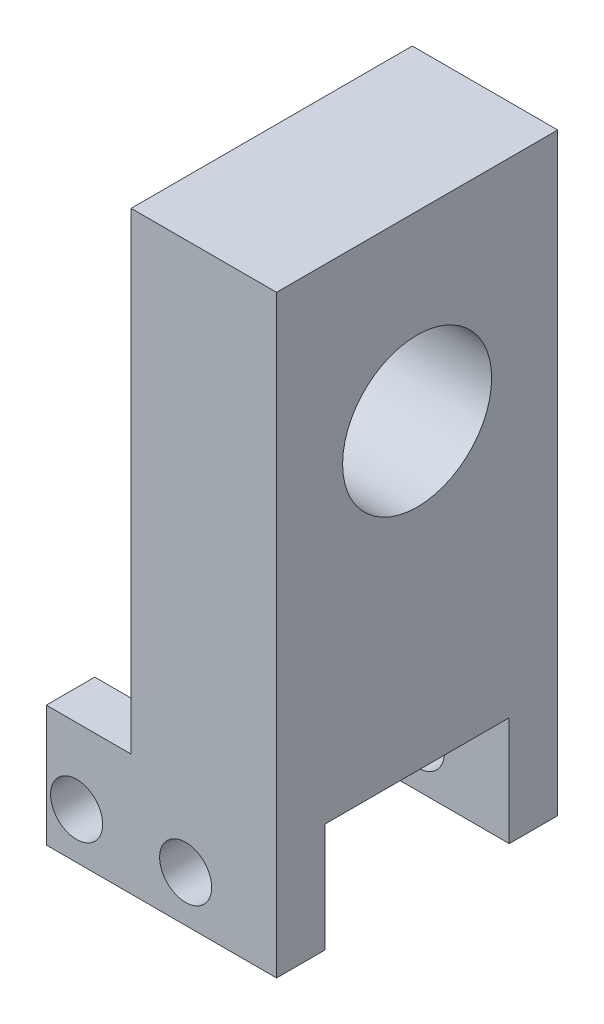
ISO-10303-21;
HEADER;
FILE_DESCRIPTION(('STEP AP214'),'2;1');
FILE_NAME('part.step','',(''),(''),'','','');
FILE_SCHEMA(('AUTOMOTIVE_DESIGN { 1 0 10303 214 1 1 1 1 }'));
ENDSEC;
DATA;
#1=APPLICATION_CONTEXT('core data for automotive mechanical design processes');
#2=APPLICATION_PROTOCOL_DEFINITION('international standard','automotive_design',2000,#1);
#3=PRODUCT_CONTEXT('',#1,'mechanical');
#4=PRODUCT('Part','Part','',(#3));
#5=PRODUCT_RELATED_PRODUCT_CATEGORY('part','',(#4));
#6=PRODUCT_DEFINITION_FORMATION('','',#4);
#7=PRODUCT_DEFINITION_CONTEXT('part definition',#1,'design');
#8=PRODUCT_DEFINITION('design','',#6,#7);
#9=PRODUCT_DEFINITION_SHAPE('','',#8);
#10=(LENGTH_UNIT() NAMED_UNIT(*) SI_UNIT(.MILLI.,.METRE.));
#11=(NAMED_UNIT(*) PLANE_ANGLE_UNIT() SI_UNIT($,.RADIAN.));
#12=(NAMED_UNIT(*) SI_UNIT($,.STERADIAN.) SOLID_ANGLE_UNIT());
#13=UNCERTAINTY_MEASURE_WITH_UNIT(LENGTH_MEASURE(1.E-05),#10,'distance_accuracy_value','');
#14=(GEOMETRIC_REPRESENTATION_CONTEXT(3) GLOBAL_UNCERTAINTY_ASSIGNED_CONTEXT((#13)) GLOBAL_UNIT_ASSIGNED_CONTEXT((#10,
#11,#12)) REPRESENTATION_CONTEXT('',''));
#15=CARTESIAN_POINT('',(0.,0.,0.));
#16=DIRECTION('',(0.,0.,1.));
#17=DIRECTION('',(1.,0.,0.));
#18=AXIS2_PLACEMENT_3D('',#15,#16,#17);
#19=CARTESIAN_POINT('',(65.,84.,61.6));
#20=DIRECTION('',(1.,0.,0.));
#21=DIRECTION('',(0.,0.,-1.));
#22=AXIS2_PLACEMENT_3D('',#19,#20,#21);
#23=PLANE('',#22);
#24=CARTESIAN_POINT('',(65.,69.,50.));
#25=DIRECTION('',(1.,0.,0.));
#26=DIRECTION('',(0.,0.,-1.));
#27=AXIS2_PLACEMENT_3D('',#24,#25,#26);
#28=CIRCLE('',#27,6.15);
#29=CARTESIAN_POINT('',(65.,69.,43.85));
#30=VERTEX_POINT('',#29);
#31=EDGE_CURVE('E231',#30,#30,#28,.T.);
#32=ORIENTED_EDGE('',*,*,#31,.T.);
#33=EDGE_LOOP('',(#32));
#34=FACE_BOUND('',#33,.T.);
#35=DIRECTION('',(0.,0.,-1.));
#36=VECTOR('',#35,1.);
#37=CARTESIAN_POINT('',(65.,45.,61.6));
#38=LINE('',#37,#36);
#39=CARTESIAN_POINT('',(65.,45.,61.6));
#40=VERTEX_POINT('',#39);
#41=CARTESIAN_POINT('',(65.,45.,57.6));
#42=VERTEX_POINT('',#41);
#43=EDGE_CURVE('E11',#40,#42,#38,.T.);
#44=ORIENTED_EDGE('',*,*,#43,.F.);
#45=DIRECTION('',(0.,-1.,0.));
#46=VECTOR('',#45,1.);
#47=CARTESIAN_POINT('',(65.,84.,61.6));
#48=LINE('',#47,#46);
#49=CARTESIAN_POINT('',(65.,84.,61.6));
#50=VERTEX_POINT('',#49);
#51=EDGE_CURVE('E191',#50,#40,#48,.T.);
#52=ORIENTED_EDGE('',*,*,#51,.F.);
#53=DIRECTION('',(0.,0.,-1.));
#54=VECTOR('',#53,1.);
#55=CARTESIAN_POINT('',(65.,84.,61.6));
#56=LINE('',#55,#54);
#57=CARTESIAN_POINT('',(65.,84.,38.4));
#58=VERTEX_POINT('',#57);
#59=EDGE_CURVE('E198',#50,#58,#56,.T.);
#60=ORIENTED_EDGE('',*,*,#59,.T.);
#61=DIRECTION('',(0.,-1.,0.));
#62=VECTOR('',#61,1.);
#63=CARTESIAN_POINT('',(65.,84.,38.4));
#64=LINE('',#63,#62);
#65=CARTESIAN_POINT('',(65.,45.,38.4));
#66=VERTEX_POINT('',#65);
#67=EDGE_CURVE('E187',#58,#66,#64,.T.);
#68=ORIENTED_EDGE('',*,*,#67,.T.);
#69=DIRECTION('',(0.,0.,-1.));
#70=VECTOR('',#69,1.);
#71=CARTESIAN_POINT('',(65.,45.,61.6));
#72=LINE('',#71,#70);
#73=CARTESIAN_POINT('',(65.,45.,42.4));
#74=VERTEX_POINT('',#73);
#75=EDGE_CURVE('E50',#74,#66,#72,.T.);
#76=ORIENTED_EDGE('',*,*,#75,.F.);
#77=DIRECTION('',(0.,-1.,0.));
#78=VECTOR('',#77,1.);
#79=CARTESIAN_POINT('',(65.,84.,42.4));
#80=LINE('',#79,#78);
#81=CARTESIAN_POINT('',(65.,44.,42.4));
#82=VERTEX_POINT('',#81);
#83=EDGE_CURVE('E190',#74,#82,#80,.T.);
#84=ORIENTED_EDGE('',*,*,#83,.T.);
#85=DIRECTION('',(0.,0.,-1.));
#86=VECTOR('',#85,1.);
#87=CARTESIAN_POINT('',(65.,44.,61.6));
#88=LINE('',#87,#86);
#89=CARTESIAN_POINT('',(65.,44.,57.6));
#90=VERTEX_POINT('',#89);
#91=EDGE_CURVE('E212',#90,#82,#88,.T.);
#92=ORIENTED_EDGE('',*,*,#91,.F.);
#93=DIRECTION('',(0.,-1.,0.));
#94=VECTOR('',#93,1.);
#95=CARTESIAN_POINT('',(65.,84.,57.6));
#96=LINE('',#95,#94);
#97=EDGE_CURVE('E54',#42,#90,#96,.T.);
#98=ORIENTED_EDGE('',*,*,#97,.F.);
#99=EDGE_LOOP('',(#44,#52,#60,#68,#76,#84,#92,#98));
#100=FACE_BOUND('',#99,.T.);
#101=ADVANCED_FACE('F39',(#34,#100),#23,.F.);
#102=CARTESIAN_POINT('',(65.,44.,61.6));
#103=DIRECTION('',(0.,1.,0.));
#104=DIRECTION('',(0.,0.,1.));
#105=AXIS2_PLACEMENT_3D('',#102,#103,#104);
#106=PLANE('',#105);
#107=DIRECTION('',(1.,0.,0.));
#108=VECTOR('',#107,1.);
#109=CARTESIAN_POINT('',(65.,44.,57.6));
#110=LINE('',#109,#108);
#111=CARTESIAN_POINT('',(77.,44.,57.6));
#112=VERTEX_POINT('',#111);
#113=EDGE_CURVE('E153',#90,#112,#110,.T.);
#114=ORIENTED_EDGE('',*,*,#113,.F.);
#115=ORIENTED_EDGE('',*,*,#91,.T.);
#116=DIRECTION('',(1.,0.,0.));
#117=VECTOR('',#116,1.);
#118=CARTESIAN_POINT('',(65.,44.,42.4));
#119=LINE('',#118,#117);
#120=CARTESIAN_POINT('',(77.,44.,42.4));
#121=VERTEX_POINT('',#120);
#122=EDGE_CURVE('E214',#82,#121,#119,.T.);
#123=ORIENTED_EDGE('',*,*,#122,.T.);
#124=DIRECTION('',(0.,0.,-1.));
#125=VECTOR('',#124,1.);
#126=CARTESIAN_POINT('',(77.,44.,61.6));
#127=LINE('',#126,#125);
#128=EDGE_CURVE('E206',#112,#121,#127,.T.);
#129=ORIENTED_EDGE('',*,*,#128,.F.);
#130=EDGE_LOOP('',(#114,#115,#123,#129));
#131=FACE_BOUND('',#130,.T.);
#132=ADVANCED_FACE('F270',(#131),#106,.F.);
#133=CARTESIAN_POINT('',(77.,44.,61.6));
#134=DIRECTION('',(-1.,0.,0.));
#135=DIRECTION('',(0.,0.,1.));
#136=AXIS2_PLACEMENT_3D('',#133,#134,#135);
#137=PLANE('',#136);
#138=CARTESIAN_POINT('',(77.,69.,50.));
#139=DIRECTION('',(1.,0.,0.));
#140=DIRECTION('',(0.,0.,-1.));
#141=AXIS2_PLACEMENT_3D('',#138,#139,#140);
#142=CIRCLE('',#141,6.15);
#143=CARTESIAN_POINT('',(77.,69.,43.85));
#144=VERTEX_POINT('',#143);
#145=EDGE_CURVE('E238',#144,#144,#142,.T.);
#146=ORIENTED_EDGE('',*,*,#145,.F.);
#147=EDGE_LOOP('',(#146));
#148=FACE_BOUND('',#147,.T.);
#149=DIRECTION('',(0.,1.,0.));
#150=VECTOR('',#149,1.);
#151=CARTESIAN_POINT('',(77.,44.,61.6));
#152=LINE('',#151,#150);
#153=CARTESIAN_POINT('',(77.,35.,61.6));
#154=VERTEX_POINT('',#153);
#155=CARTESIAN_POINT('',(77.,84.,61.6));
#156=VERTEX_POINT('',#155);
#157=EDGE_CURVE('E193',#154,#156,#152,.T.);
#158=ORIENTED_EDGE('',*,*,#157,.F.);
#159=DIRECTION('',(0.,0.,-1.));
#160=VECTOR('',#159,1.);
#161=CARTESIAN_POINT('',(77.,35.,61.6));
#162=LINE('',#161,#160);
#163=CARTESIAN_POINT('',(77.,35.,57.6));
#164=VERTEX_POINT('',#163);
#165=EDGE_CURVE('E133',#154,#164,#162,.T.);
#166=ORIENTED_EDGE('',*,*,#165,.T.);
#167=DIRECTION('',(0.,1.,0.));
#168=VECTOR('',#167,1.);
#169=CARTESIAN_POINT('',(77.,35.,57.6));
#170=LINE('',#169,#168);
#171=EDGE_CURVE('E250',#164,#112,#170,.T.);
#172=ORIENTED_EDGE('',*,*,#171,.T.);
#173=ORIENTED_EDGE('',*,*,#128,.T.);
#174=DIRECTION('',(0.,1.,0.));
#175=VECTOR('',#174,1.);
#176=CARTESIAN_POINT('',(77.,35.,42.4));
#177=LINE('',#176,#175);
#178=CARTESIAN_POINT('',(77.,35.,42.4));
#179=VERTEX_POINT('',#178);
#180=EDGE_CURVE('E166',#179,#121,#177,.T.);
#181=ORIENTED_EDGE('',*,*,#180,.F.);
#182=DIRECTION('',(0.,0.,-1.));
#183=VECTOR('',#182,1.);
#184=CARTESIAN_POINT('',(77.,35.,42.4));
#185=LINE('',#184,#183);
#186=CARTESIAN_POINT('',(77.,35.,38.4));
#187=VERTEX_POINT('',#186);
#188=EDGE_CURVE('E183',#179,#187,#185,.T.);
#189=ORIENTED_EDGE('',*,*,#188,.T.);
#190=DIRECTION('',(0.,1.,0.));
#191=VECTOR('',#190,1.);
#192=CARTESIAN_POINT('',(77.,44.,38.4));
#193=LINE('',#192,#191);
#194=CARTESIAN_POINT('',(77.,84.,38.4));
#195=VERTEX_POINT('',#194);
#196=EDGE_CURVE('E201',#187,#195,#193,.T.);
#197=ORIENTED_EDGE('',*,*,#196,.T.);
#198=DIRECTION('',(0.,0.,-1.));
#199=VECTOR('',#198,1.);
#200=CARTESIAN_POINT('',(77.,84.,61.6));
#201=LINE('',#200,#199);
#202=EDGE_CURVE('E207',#156,#195,#201,.T.);
#203=ORIENTED_EDGE('',*,*,#202,.F.);
#204=EDGE_LOOP('',(#158,#166,#172,#173,#181,#189,#197,#203));
#205=FACE_BOUND('',#204,.T.);
#206=ADVANCED_FACE('F256',(#148,#205),#137,.F.);
#207=CARTESIAN_POINT('',(77.,84.,61.6));
#208=DIRECTION('',(0.,-1.,0.));
#209=DIRECTION('',(0.,0.,-1.));
#210=AXIS2_PLACEMENT_3D('',#207,#208,#209);
#211=PLANE('',#210);
#212=DIRECTION('',(-1.,0.,0.));
#213=VECTOR('',#212,1.);
#214=CARTESIAN_POINT('',(77.,84.,38.4));
#215=LINE('',#214,#213);
#216=EDGE_CURVE('E192',#195,#58,#215,.T.);
#217=ORIENTED_EDGE('',*,*,#216,.T.);
#218=ORIENTED_EDGE('',*,*,#59,.F.);
#219=DIRECTION('',(-1.,0.,0.));
#220=VECTOR('',#219,1.);
#221=CARTESIAN_POINT('',(77.,84.,61.6));
#222=LINE('',#221,#220);
#223=EDGE_CURVE('E196',#156,#50,#222,.T.);
#224=ORIENTED_EDGE('',*,*,#223,.F.);
#225=ORIENTED_EDGE('',*,*,#202,.T.);
#226=EDGE_LOOP('',(#217,#218,#224,#225));
#227=FACE_BOUND('',#226,.T.);
#228=ADVANCED_FACE('F261',(#227),#211,.F.);
#229=CARTESIAN_POINT('',(0.,0.,61.6));
#230=DIRECTION('',(0.,0.,1.));
#231=DIRECTION('',(1.,0.,0.));
#232=AXIS2_PLACEMENT_3D('',#229,#230,#231);
#233=PLANE('',#232);
#234=CARTESIAN_POINT('',(60.5,38.8,61.6));
#235=DIRECTION('',(0.,0.,1.));
#236=DIRECTION('',(1.,0.,0.));
#237=AXIS2_PLACEMENT_3D('',#234,#235,#236);
#238=CIRCLE('',#237,2.15);
#239=CARTESIAN_POINT('',(62.65,38.8,61.6));
#240=VERTEX_POINT('',#239);
#241=EDGE_CURVE('E218',#240,#240,#238,.T.);
#242=ORIENTED_EDGE('',*,*,#241,.F.);
#243=EDGE_LOOP('',(#242));
#244=FACE_BOUND('',#243,.T.);
#245=CARTESIAN_POINT('',(69.5,38.8,61.6));
#246=DIRECTION('',(0.,0.,1.));
#247=DIRECTION('',(1.,0.,0.));
#248=AXIS2_PLACEMENT_3D('',#245,#246,#247);
#249=CIRCLE('',#248,2.15);
#250=CARTESIAN_POINT('',(71.65,38.8,61.6));
#251=VERTEX_POINT('',#250);
#252=EDGE_CURVE('E239',#251,#251,#249,.T.);
#253=ORIENTED_EDGE('',*,*,#252,.F.);
#254=EDGE_LOOP('',(#253));
#255=FACE_BOUND('',#254,.T.);
#256=ORIENTED_EDGE('',*,*,#51,.T.);
#257=DIRECTION('',(-1.,0.,0.));
#258=VECTOR('',#257,1.);
#259=CARTESIAN_POINT('',(77.,45.,61.6));
#260=LINE('',#259,#258);
#261=CARTESIAN_POINT('',(58.,45.,61.6));
#262=VERTEX_POINT('',#261);
#263=EDGE_CURVE('E140',#40,#262,#260,.T.);
#264=ORIENTED_EDGE('',*,*,#263,.T.);
#265=DIRECTION('',(0.,-1.,0.));
#266=VECTOR('',#265,1.);
#267=CARTESIAN_POINT('',(58.,45.,61.6));
#268=LINE('',#267,#266);
#269=CARTESIAN_POINT('',(58.,35.,61.6));
#270=VERTEX_POINT('',#269);
#271=EDGE_CURVE('E139',#262,#270,#268,.T.);
#272=ORIENTED_EDGE('',*,*,#271,.T.);
#273=DIRECTION('',(1.,0.,0.));
#274=VECTOR('',#273,1.);
#275=CARTESIAN_POINT('',(58.,35.,61.6));
#276=LINE('',#275,#274);
#277=EDGE_CURVE('E127',#270,#154,#276,.T.);
#278=ORIENTED_EDGE('',*,*,#277,.T.);
#279=ORIENTED_EDGE('',*,*,#157,.T.);
#280=ORIENTED_EDGE('',*,*,#223,.T.);
#281=EDGE_LOOP('',(#256,#264,#272,#278,#279,#280));
#282=FACE_BOUND('',#281,.T.);
#283=ADVANCED_FACE('F144',(#244,#255,#282),#233,.T.);
#284=CARTESIAN_POINT('',(0.,0.,38.4));
#285=DIRECTION('',(0.,0.,1.));
#286=DIRECTION('',(1.,0.,0.));
#287=AXIS2_PLACEMENT_3D('',#284,#285,#286);
#288=PLANE('',#287);
#289=CARTESIAN_POINT('',(60.5,38.8,38.4));
#290=DIRECTION('',(0.,0.,1.));
#291=DIRECTION('',(1.,0.,0.));
#292=AXIS2_PLACEMENT_3D('',#289,#290,#291);
#293=CIRCLE('',#292,2.15);
#294=CARTESIAN_POINT('',(62.65,38.8,38.4));
#295=VERTEX_POINT('',#294);
#296=EDGE_CURVE('E221',#295,#295,#293,.T.);
#297=ORIENTED_EDGE('',*,*,#296,.T.);
#298=EDGE_LOOP('',(#297));
#299=FACE_BOUND('',#298,.T.);
#300=CARTESIAN_POINT('',(69.5,38.8,38.4));
#301=DIRECTION('',(0.,0.,1.));
#302=DIRECTION('',(1.,0.,0.));
#303=AXIS2_PLACEMENT_3D('',#300,#301,#302);
#304=CIRCLE('',#303,2.15);
#305=CARTESIAN_POINT('',(71.65,38.8,38.4));
#306=VERTEX_POINT('',#305);
#307=EDGE_CURVE('E229',#306,#306,#304,.T.);
#308=ORIENTED_EDGE('',*,*,#307,.T.);
#309=EDGE_LOOP('',(#308));
#310=FACE_BOUND('',#309,.T.);
#311=ORIENTED_EDGE('',*,*,#216,.F.);
#312=ORIENTED_EDGE('',*,*,#196,.F.);
#313=DIRECTION('',(1.,0.,0.));
#314=VECTOR('',#313,1.);
#315=CARTESIAN_POINT('',(58.,35.,38.4));
#316=LINE('',#315,#314);
#317=CARTESIAN_POINT('',(58.,35.,38.4));
#318=VERTEX_POINT('',#317);
#319=EDGE_CURVE('E171',#318,#187,#316,.T.);
#320=ORIENTED_EDGE('',*,*,#319,.F.);
#321=DIRECTION('',(0.,-1.,0.));
#322=VECTOR('',#321,1.);
#323=CARTESIAN_POINT('',(58.,45.,38.4));
#324=LINE('',#323,#322);
#325=CARTESIAN_POINT('',(58.,45.,38.4));
#326=VERTEX_POINT('',#325);
#327=EDGE_CURVE('E158',#326,#318,#324,.T.);
#328=ORIENTED_EDGE('',*,*,#327,.F.);
#329=DIRECTION('',(-1.,0.,0.));
#330=VECTOR('',#329,1.);
#331=CARTESIAN_POINT('',(77.,45.,38.4));
#332=LINE('',#331,#330);
#333=EDGE_CURVE('E163',#66,#326,#332,.T.);
#334=ORIENTED_EDGE('',*,*,#333,.F.);
#335=ORIENTED_EDGE('',*,*,#67,.F.);
#336=EDGE_LOOP('',(#311,#312,#320,#328,#334,#335));
#337=FACE_BOUND('',#336,.T.);
#338=ADVANCED_FACE('F288',(#299,#310,#337),#288,.F.);
#339=CARTESIAN_POINT('',(77.,45.,42.4));
#340=DIRECTION('',(0.,-1.,0.));
#341=DIRECTION('',(0.,0.,-1.));
#342=AXIS2_PLACEMENT_3D('',#339,#340,#341);
#343=PLANE('',#342);
#344=DIRECTION('',(-1.,0.,0.));
#345=VECTOR('',#344,1.);
#346=CARTESIAN_POINT('',(77.,45.,42.4));
#347=LINE('',#346,#345);
#348=CARTESIAN_POINT('',(58.,45.,42.4));
#349=VERTEX_POINT('',#348);
#350=EDGE_CURVE('E167',#74,#349,#347,.T.);
#351=ORIENTED_EDGE('',*,*,#350,.F.);
#352=ORIENTED_EDGE('',*,*,#75,.T.);
#353=ORIENTED_EDGE('',*,*,#333,.T.);
#354=DIRECTION('',(0.,0.,-1.));
#355=VECTOR('',#354,1.);
#356=CARTESIAN_POINT('',(58.,45.,42.4));
#357=LINE('',#356,#355);
#358=EDGE_CURVE('E174',#349,#326,#357,.T.);
#359=ORIENTED_EDGE('',*,*,#358,.F.);
#360=EDGE_LOOP('',(#351,#352,#353,#359));
#361=FACE_BOUND('',#360,.T.);
#362=ADVANCED_FACE('F295',(#361),#343,.F.);
#363=CARTESIAN_POINT('',(0.,0.,42.4));
#364=DIRECTION('',(0.,0.,1.));
#365=DIRECTION('',(1.,0.,0.));
#366=AXIS2_PLACEMENT_3D('',#363,#364,#365);
#367=PLANE('',#366);
#368=CARTESIAN_POINT('',(60.5,38.8,42.4));
#369=DIRECTION('',(0.,0.,1.));
#370=DIRECTION('',(1.,0.,0.));
#371=AXIS2_PLACEMENT_3D('',#368,#369,#370);
#372=CIRCLE('',#371,2.15);
#373=CARTESIAN_POINT('',(62.65,38.8,42.4));
#374=VERTEX_POINT('',#373);
#375=EDGE_CURVE('E241',#374,#374,#372,.F.);
#376=ORIENTED_EDGE('',*,*,#375,.T.);
#377=EDGE_LOOP('',(#376));
#378=FACE_BOUND('',#377,.T.);
#379=CARTESIAN_POINT('',(69.5,38.8,42.4));
#380=DIRECTION('',(0.,0.,1.));
#381=DIRECTION('',(1.,0.,0.));
#382=AXIS2_PLACEMENT_3D('',#379,#380,#381);
#383=CIRCLE('',#382,2.15);
#384=CARTESIAN_POINT('',(71.65,38.8,42.4));
#385=VERTEX_POINT('',#384);
#386=EDGE_CURVE('E220',#385,#385,#383,.F.);
#387=ORIENTED_EDGE('',*,*,#386,.T.);
#388=EDGE_LOOP('',(#387));
#389=FACE_BOUND('',#388,.T.);
#390=ORIENTED_EDGE('',*,*,#83,.F.);
#391=ORIENTED_EDGE('',*,*,#350,.T.);
#392=DIRECTION('',(0.,-1.,0.));
#393=VECTOR('',#392,1.);
#394=CARTESIAN_POINT('',(58.,45.,42.4));
#395=LINE('',#394,#393);
#396=CARTESIAN_POINT('',(58.,35.,42.4));
#397=VERTEX_POINT('',#396);
#398=EDGE_CURVE('E162',#349,#397,#395,.T.);
#399=ORIENTED_EDGE('',*,*,#398,.T.);
#400=DIRECTION('',(1.,0.,0.));
#401=VECTOR('',#400,1.);
#402=CARTESIAN_POINT('',(58.,35.,42.4));
#403=LINE('',#402,#401);
#404=EDGE_CURVE('E161',#397,#179,#403,.T.);
#405=ORIENTED_EDGE('',*,*,#404,.T.);
#406=ORIENTED_EDGE('',*,*,#180,.T.);
#407=ORIENTED_EDGE('',*,*,#122,.F.);
#408=EDGE_LOOP('',(#390,#391,#399,#405,#406,#407));
#409=FACE_BOUND('',#408,.T.);
#410=ADVANCED_FACE('F305',(#378,#389,#409),#367,.T.);
#411=CARTESIAN_POINT('',(58.,45.,42.4));
#412=DIRECTION('',(1.,0.,0.));
#413=DIRECTION('',(0.,0.,-1.));
#414=AXIS2_PLACEMENT_3D('',#411,#412,#413);
#415=PLANE('',#414);
#416=ORIENTED_EDGE('',*,*,#327,.T.);
#417=DIRECTION('',(0.,0.,-1.));
#418=VECTOR('',#417,1.);
#419=CARTESIAN_POINT('',(58.,35.,42.4));
#420=LINE('',#419,#418);
#421=EDGE_CURVE('E185',#397,#318,#420,.T.);
#422=ORIENTED_EDGE('',*,*,#421,.F.);
#423=ORIENTED_EDGE('',*,*,#398,.F.);
#424=ORIENTED_EDGE('',*,*,#358,.T.);
#425=EDGE_LOOP('',(#416,#422,#423,#424));
#426=FACE_BOUND('',#425,.T.);
#427=ADVANCED_FACE('F297',(#426),#415,.F.);
#428=CARTESIAN_POINT('',(58.,35.,42.4));
#429=DIRECTION('',(0.,1.,0.));
#430=DIRECTION('',(0.,0.,1.));
#431=AXIS2_PLACEMENT_3D('',#428,#429,#430);
#432=PLANE('',#431);
#433=ORIENTED_EDGE('',*,*,#319,.T.);
#434=ORIENTED_EDGE('',*,*,#188,.F.);
#435=ORIENTED_EDGE('',*,*,#404,.F.);
#436=ORIENTED_EDGE('',*,*,#421,.T.);
#437=EDGE_LOOP('',(#433,#434,#435,#436));
#438=FACE_BOUND('',#437,.T.);
#439=ADVANCED_FACE('F303',(#438),#432,.F.);
#440=CARTESIAN_POINT('',(77.,45.,61.6));
#441=DIRECTION('',(0.,-1.,0.));
#442=DIRECTION('',(0.,0.,-1.));
#443=AXIS2_PLACEMENT_3D('',#440,#441,#442);
#444=PLANE('',#443);
#445=ORIENTED_EDGE('',*,*,#263,.F.);
#446=ORIENTED_EDGE('',*,*,#43,.T.);
#447=DIRECTION('',(-1.,0.,0.));
#448=VECTOR('',#447,1.);
#449=CARTESIAN_POINT('',(77.,45.,57.6));
#450=LINE('',#449,#448);
#451=CARTESIAN_POINT('',(58.,45.,57.6));
#452=VERTEX_POINT('',#451);
#453=EDGE_CURVE('E148',#42,#452,#450,.T.);
#454=ORIENTED_EDGE('',*,*,#453,.T.);
#455=DIRECTION('',(0.,0.,-1.));
#456=VECTOR('',#455,1.);
#457=CARTESIAN_POINT('',(58.,45.,61.6));
#458=LINE('',#457,#456);
#459=EDGE_CURVE('E154',#262,#452,#458,.T.);
#460=ORIENTED_EDGE('',*,*,#459,.F.);
#461=EDGE_LOOP('',(#445,#446,#454,#460));
#462=FACE_BOUND('',#461,.T.);
#463=ADVANCED_FACE('F307',(#462),#444,.F.);
#464=CARTESIAN_POINT('',(0.,0.,57.6));
#465=DIRECTION('',(0.,0.,1.));
#466=DIRECTION('',(1.,0.,0.));
#467=AXIS2_PLACEMENT_3D('',#464,#465,#466);
#468=PLANE('',#467);
#469=CARTESIAN_POINT('',(60.5,38.8,57.6));
#470=DIRECTION('',(0.,0.,1.));
#471=DIRECTION('',(1.,0.,0.));
#472=AXIS2_PLACEMENT_3D('',#469,#470,#471);
#473=CIRCLE('',#472,2.15);
#474=CARTESIAN_POINT('',(62.65,38.8,57.6));
#475=VERTEX_POINT('',#474);
#476=EDGE_CURVE('E45',#475,#475,#473,.F.);
#477=ORIENTED_EDGE('',*,*,#476,.F.);
#478=EDGE_LOOP('',(#477));
#479=FACE_BOUND('',#478,.T.);
#480=CARTESIAN_POINT('',(69.5,38.8,57.6));
#481=DIRECTION('',(0.,0.,1.));
#482=DIRECTION('',(1.,0.,0.));
#483=AXIS2_PLACEMENT_3D('',#480,#481,#482);
#484=CIRCLE('',#483,2.15);
#485=CARTESIAN_POINT('',(71.65,38.8,57.6));
#486=VERTEX_POINT('',#485);
#487=EDGE_CURVE('E219',#486,#486,#484,.F.);
#488=ORIENTED_EDGE('',*,*,#487,.F.);
#489=EDGE_LOOP('',(#488));
#490=FACE_BOUND('',#489,.T.);
#491=ORIENTED_EDGE('',*,*,#453,.F.);
#492=ORIENTED_EDGE('',*,*,#97,.T.);
#493=ORIENTED_EDGE('',*,*,#113,.T.);
#494=ORIENTED_EDGE('',*,*,#171,.F.);
#495=DIRECTION('',(1.,0.,0.));
#496=VECTOR('',#495,1.);
#497=CARTESIAN_POINT('',(58.,35.,57.6));
#498=LINE('',#497,#496);
#499=CARTESIAN_POINT('',(58.,35.,57.6));
#500=VERTEX_POINT('',#499);
#501=EDGE_CURVE('E249',#500,#164,#498,.T.);
#502=ORIENTED_EDGE('',*,*,#501,.F.);
#503=DIRECTION('',(0.,-1.,0.));
#504=VECTOR('',#503,1.);
#505=CARTESIAN_POINT('',(58.,45.,57.6));
#506=LINE('',#505,#504);
#507=EDGE_CURVE('E146',#452,#500,#506,.T.);
#508=ORIENTED_EDGE('',*,*,#507,.F.);
#509=EDGE_LOOP('',(#491,#492,#493,#494,#502,#508));
#510=FACE_BOUND('',#509,.T.);
#511=ADVANCED_FACE('F254',(#479,#490,#510),#468,.F.);
#512=CARTESIAN_POINT('',(58.,45.,61.6));
#513=DIRECTION('',(1.,0.,0.));
#514=DIRECTION('',(0.,0.,-1.));
#515=AXIS2_PLACEMENT_3D('',#512,#513,#514);
#516=PLANE('',#515);
#517=ORIENTED_EDGE('',*,*,#507,.T.);
#518=DIRECTION('',(0.,0.,-1.));
#519=VECTOR('',#518,1.);
#520=CARTESIAN_POINT('',(58.,35.,61.6));
#521=LINE('',#520,#519);
#522=EDGE_CURVE('E135',#270,#500,#521,.T.);
#523=ORIENTED_EDGE('',*,*,#522,.F.);
#524=ORIENTED_EDGE('',*,*,#271,.F.);
#525=ORIENTED_EDGE('',*,*,#459,.T.);
#526=EDGE_LOOP('',(#517,#523,#524,#525));
#527=FACE_BOUND('',#526,.T.);
#528=ADVANCED_FACE('F147',(#527),#516,.F.);
#529=CARTESIAN_POINT('',(58.,35.,61.6));
#530=DIRECTION('',(0.,1.,0.));
#531=DIRECTION('',(0.,0.,1.));
#532=AXIS2_PLACEMENT_3D('',#529,#530,#531);
#533=PLANE('',#532);
#534=ORIENTED_EDGE('',*,*,#501,.T.);
#535=ORIENTED_EDGE('',*,*,#165,.F.);
#536=ORIENTED_EDGE('',*,*,#277,.F.);
#537=ORIENTED_EDGE('',*,*,#522,.T.);
#538=EDGE_LOOP('',(#534,#535,#536,#537));
#539=FACE_BOUND('',#538,.T.);
#540=ADVANCED_FACE('F129',(#539),#533,.F.);
#541=CARTESIAN_POINT('',(69.5,38.8,61.6));
#542=DIRECTION('',(0.,0.,-1.));
#543=DIRECTION('',(-1.,0.,0.));
#544=AXIS2_PLACEMENT_3D('',#541,#542,#543);
#545=CYLINDRICAL_SURFACE('',#544,2.15);
#546=ORIENTED_EDGE('',*,*,#252,.T.);
#547=EDGE_LOOP('',(#546));
#548=FACE_BOUND('',#547,.T.);
#549=ORIENTED_EDGE('',*,*,#487,.T.);
#550=EDGE_LOOP('',(#549));
#551=FACE_BOUND('',#550,.T.);
#552=ADVANCED_FACE('F320',(#548,#551),#545,.F.);
#553=CARTESIAN_POINT('',(60.5,38.8,61.6));
#554=DIRECTION('',(0.,0.,-1.));
#555=DIRECTION('',(-1.,0.,0.));
#556=AXIS2_PLACEMENT_3D('',#553,#554,#555);
#557=CYLINDRICAL_SURFACE('',#556,2.15);
#558=ORIENTED_EDGE('',*,*,#241,.T.);
#559=EDGE_LOOP('',(#558));
#560=FACE_BOUND('',#559,.T.);
#561=ORIENTED_EDGE('',*,*,#476,.T.);
#562=EDGE_LOOP('',(#561));
#563=FACE_BOUND('',#562,.T.);
#564=ADVANCED_FACE('F326',(#560,#563),#557,.F.);
#565=ORIENTED_EDGE('',*,*,#386,.F.);
#566=EDGE_LOOP('',(#565));
#567=FACE_BOUND('',#566,.T.);
#568=ORIENTED_EDGE('',*,*,#307,.F.);
#569=EDGE_LOOP('',(#568));
#570=FACE_BOUND('',#569,.T.);
#571=ADVANCED_FACE('F325',(#567,#570),#545,.F.);
#572=ORIENTED_EDGE('',*,*,#375,.F.);
#573=EDGE_LOOP('',(#572));
#574=FACE_BOUND('',#573,.T.);
#575=ORIENTED_EDGE('',*,*,#296,.F.);
#576=EDGE_LOOP('',(#575));
#577=FACE_BOUND('',#576,.T.);
#578=ADVANCED_FACE('F330',(#574,#577),#557,.F.);
#579=CARTESIAN_POINT('',(77.,69.,50.));
#580=DIRECTION('',(-1.,0.,0.));
#581=DIRECTION('',(0.,0.,1.));
#582=AXIS2_PLACEMENT_3D('',#579,#580,#581);
#583=CYLINDRICAL_SURFACE('',#582,6.15);
#584=ORIENTED_EDGE('',*,*,#145,.T.);
#585=EDGE_LOOP('',(#584));
#586=FACE_BOUND('',#585,.T.);
#587=ORIENTED_EDGE('',*,*,#31,.F.);
#588=EDGE_LOOP('',(#587));
#589=FACE_BOUND('',#588,.T.);
#590=ADVANCED_FACE('F282',(#586,#589),#583,.F.);
#591=CLOSED_SHELL('',(#101,#132,#206,#228,#283,#338,#362,#410,#427,#439,#463,#511,#528,#540,
#552,#564,#571,#578,#590));
#592=MANIFOLD_SOLID_BREP('B2',#591);
#593=ADVANCED_BREP_SHAPE_REPRESENTATION('',(#18,#592),#14);
#594=SHAPE_DEFINITION_REPRESENTATION(#9,#593);
ENDSEC;
END-ISO-10303-21;
